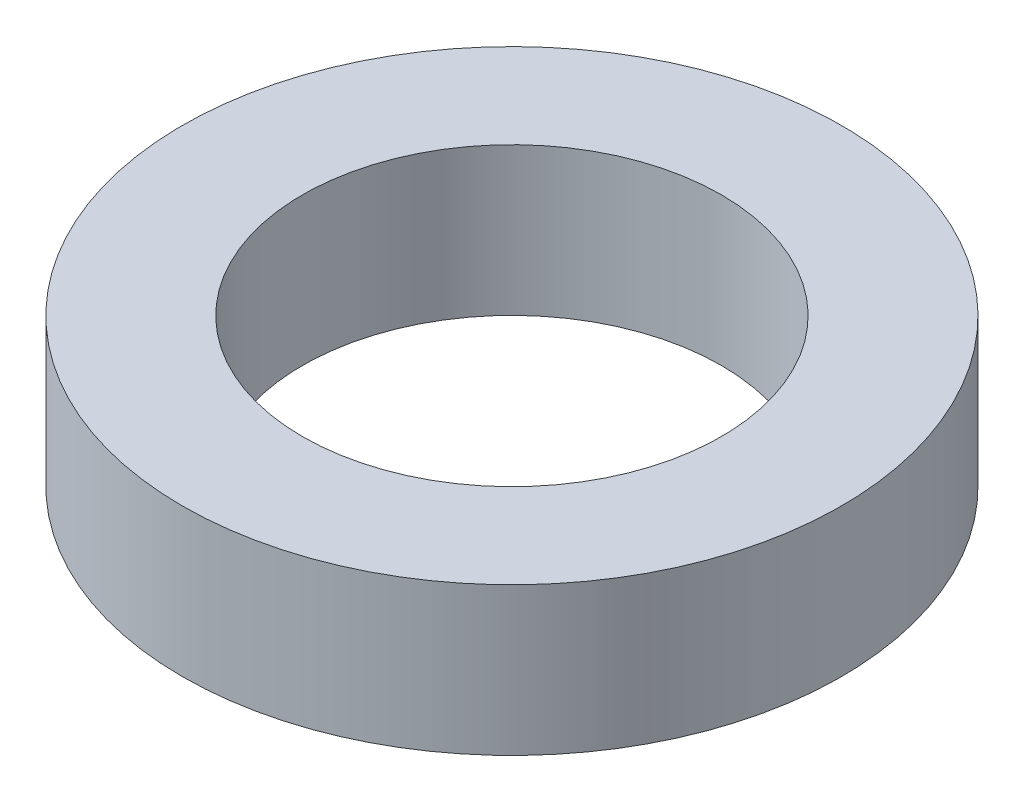
ISO-10303-21;
HEADER;
FILE_DESCRIPTION(('STEP AP214'),'2;1');
FILE_NAME('part.step','',(''),(''),'','','');
FILE_SCHEMA(('AUTOMOTIVE_DESIGN { 1 0 10303 214 1 1 1 1 }'));
ENDSEC;
DATA;
#1=APPLICATION_CONTEXT('core data for automotive mechanical design processes');
#2=APPLICATION_PROTOCOL_DEFINITION('international standard','automotive_design',2000,#1);
#3=PRODUCT_CONTEXT('',#1,'mechanical');
#4=PRODUCT('Part','Part','',(#3));
#5=PRODUCT_RELATED_PRODUCT_CATEGORY('part','',(#4));
#6=PRODUCT_DEFINITION_FORMATION('','',#4);
#7=PRODUCT_DEFINITION_CONTEXT('part definition',#1,'design');
#8=PRODUCT_DEFINITION('design','',#6,#7);
#9=PRODUCT_DEFINITION_SHAPE('','',#8);
#10=(LENGTH_UNIT() NAMED_UNIT(*) SI_UNIT(.MILLI.,.METRE.));
#11=(NAMED_UNIT(*) PLANE_ANGLE_UNIT() SI_UNIT($,.RADIAN.));
#12=(NAMED_UNIT(*) SI_UNIT($,.STERADIAN.) SOLID_ANGLE_UNIT());
#13=UNCERTAINTY_MEASURE_WITH_UNIT(LENGTH_MEASURE(1.E-05),#10,'distance_accuracy_value','');
#14=(GEOMETRIC_REPRESENTATION_CONTEXT(3) GLOBAL_UNCERTAINTY_ASSIGNED_CONTEXT((#13)) GLOBAL_UNIT_ASSIGNED_CONTEXT((#10,
#11,#12)) REPRESENTATION_CONTEXT('',''));
#15=CARTESIAN_POINT('',(0.,0.,0.));
#16=DIRECTION('',(0.,0.,1.));
#17=DIRECTION('',(1.,0.,0.));
#18=AXIS2_PLACEMENT_3D('',#15,#16,#17);
#19=CARTESIAN_POINT('',(0.,2.4,0.));
#20=DIRECTION('',(0.,1.,0.));
#21=DIRECTION('',(0.,0.,1.));
#22=AXIS2_PLACEMENT_3D('',#19,#20,#21);
#23=PLANE('',#22);
#24=CARTESIAN_POINT('',(0.,2.4,0.));
#25=DIRECTION('',(0.,1.,0.));
#26=DIRECTION('',(0.,0.,1.));
#27=AXIS2_PLACEMENT_3D('',#24,#25,#26);
#28=CIRCLE('',#27,5.35);
#29=CARTESIAN_POINT('',(0.,2.4,5.35));
#30=VERTEX_POINT('',#29);
#31=EDGE_CURVE('E10',#30,#30,#28,.T.);
#32=ORIENTED_EDGE('',*,*,#31,.T.);
#33=EDGE_LOOP('',(#32));
#34=FACE_BOUND('',#33,.T.);
#35=CARTESIAN_POINT('',(0.,2.4,0.));
#36=DIRECTION('',(0.,1.,0.));
#37=DIRECTION('',(0.,0.,1.));
#38=AXIS2_PLACEMENT_3D('',#35,#36,#37);
#39=CIRCLE('',#38,3.4);
#40=CARTESIAN_POINT('',(0.,2.4,3.4));
#41=VERTEX_POINT('',#40);
#42=EDGE_CURVE('E50',#41,#41,#39,.T.);
#43=ORIENTED_EDGE('',*,*,#42,.F.);
#44=EDGE_LOOP('',(#43));
#45=FACE_BOUND('',#44,.T.);
#46=ADVANCED_FACE('F37',(#34,#45),#23,.T.);
#47=CARTESIAN_POINT('',(0.,0.,0.));
#48=DIRECTION('',(0.,1.,0.));
#49=DIRECTION('',(0.,0.,1.));
#50=AXIS2_PLACEMENT_3D('',#47,#48,#49);
#51=PLANE('',#50);
#52=CARTESIAN_POINT('',(0.,0.,0.));
#53=DIRECTION('',(0.,1.,0.));
#54=DIRECTION('',(0.,0.,1.));
#55=AXIS2_PLACEMENT_3D('',#52,#53,#54);
#56=CIRCLE('',#55,5.35);
#57=CARTESIAN_POINT('',(0.,0.,5.35));
#58=VERTEX_POINT('',#57);
#59=EDGE_CURVE('E41',#58,#58,#56,.T.);
#60=ORIENTED_EDGE('',*,*,#59,.F.);
#61=EDGE_LOOP('',(#60));
#62=FACE_BOUND('',#61,.T.);
#63=CARTESIAN_POINT('',(0.,0.,0.));
#64=DIRECTION('',(0.,1.,0.));
#65=DIRECTION('',(0.,0.,1.));
#66=AXIS2_PLACEMENT_3D('',#63,#64,#65);
#67=CIRCLE('',#66,3.4);
#68=CARTESIAN_POINT('',(0.,0.,3.4));
#69=VERTEX_POINT('',#68);
#70=EDGE_CURVE('E52',#69,#69,#67,.T.);
#71=ORIENTED_EDGE('',*,*,#70,.T.);
#72=EDGE_LOOP('',(#71));
#73=FACE_BOUND('',#72,.T.);
#74=ADVANCED_FACE('F64',(#62,#73),#51,.F.);
#75=CARTESIAN_POINT('',(0.,2.4,0.));
#76=DIRECTION('',(0.,-1.,0.));
#77=DIRECTION('',(0.,0.,-1.));
#78=AXIS2_PLACEMENT_3D('',#75,#76,#77);
#79=CYLINDRICAL_SURFACE('',#78,5.35);
#80=ORIENTED_EDGE('',*,*,#31,.F.);
#81=EDGE_LOOP('',(#80));
#82=FACE_BOUND('',#81,.T.);
#83=ORIENTED_EDGE('',*,*,#59,.T.);
#84=EDGE_LOOP('',(#83));
#85=FACE_BOUND('',#84,.T.);
#86=ADVANCED_FACE('F39',(#82,#85),#79,.T.);
#87=CARTESIAN_POINT('',(0.,2.4,0.));
#88=DIRECTION('',(0.,-1.,0.));
#89=DIRECTION('',(0.,0.,-1.));
#90=AXIS2_PLACEMENT_3D('',#87,#88,#89);
#91=CYLINDRICAL_SURFACE('',#90,3.4);
#92=ORIENTED_EDGE('',*,*,#42,.T.);
#93=EDGE_LOOP('',(#92));
#94=FACE_BOUND('',#93,.T.);
#95=ORIENTED_EDGE('',*,*,#70,.F.);
#96=EDGE_LOOP('',(#95));
#97=FACE_BOUND('',#96,.T.);
#98=ADVANCED_FACE('F60',(#94,#97),#91,.F.);
#99=CLOSED_SHELL('',(#46,#74,#86,#98));
#100=MANIFOLD_SOLID_BREP('B2',#99);
#101=ADVANCED_BREP_SHAPE_REPRESENTATION('',(#18,#100),#14);
#102=SHAPE_DEFINITION_REPRESENTATION(#9,#101);
ENDSEC;
END-ISO-10303-21;
